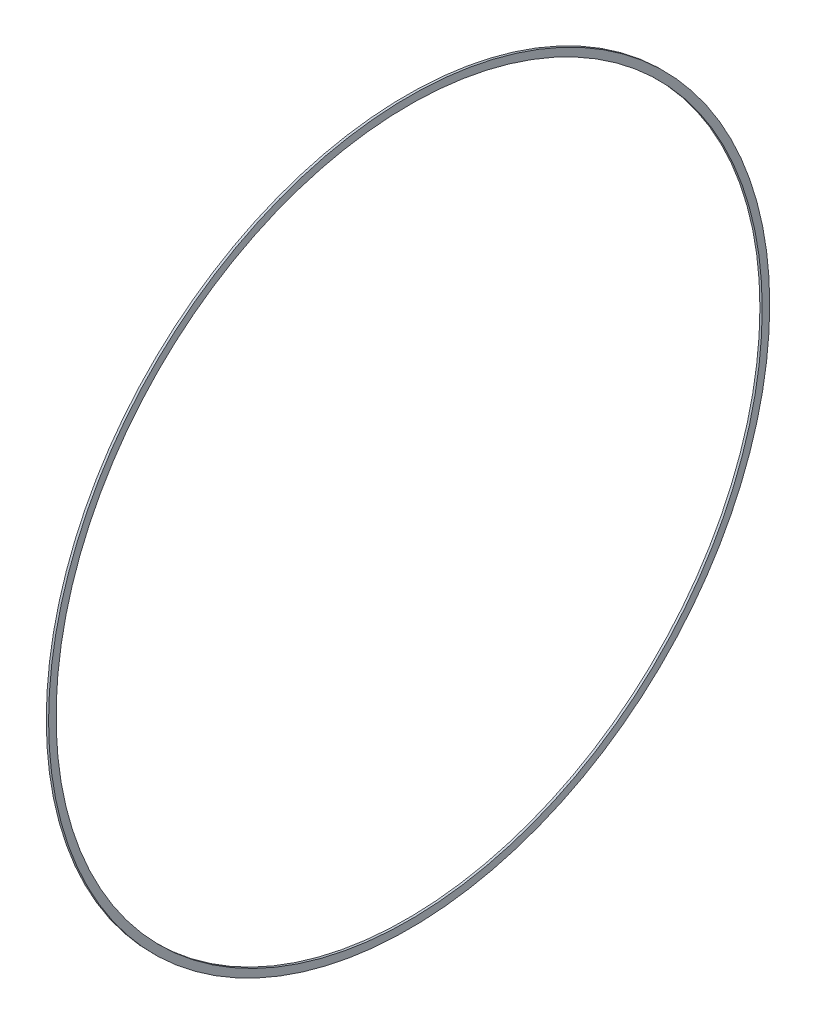
ISO-10303-21;
HEADER;
FILE_DESCRIPTION(('STEP AP214'),'2;1');
FILE_NAME('part.step','',(''),(''),'','','');
FILE_SCHEMA(('AUTOMOTIVE_DESIGN { 1 0 10303 214 1 1 1 1 }'));
ENDSEC;
DATA;
#1=APPLICATION_CONTEXT('core data for automotive mechanical design processes');
#2=APPLICATION_PROTOCOL_DEFINITION('international standard','automotive_design',2000,#1);
#3=PRODUCT_CONTEXT('',#1,'mechanical');
#4=PRODUCT('Part','Part','',(#3));
#5=PRODUCT_RELATED_PRODUCT_CATEGORY('part','',(#4));
#6=PRODUCT_DEFINITION_FORMATION('','',#4);
#7=PRODUCT_DEFINITION_CONTEXT('part definition',#1,'design');
#8=PRODUCT_DEFINITION('design','',#6,#7);
#9=PRODUCT_DEFINITION_SHAPE('','',#8);
#10=(LENGTH_UNIT() NAMED_UNIT(*) SI_UNIT(.MILLI.,.METRE.));
#11=(NAMED_UNIT(*) PLANE_ANGLE_UNIT() SI_UNIT($,.RADIAN.));
#12=(NAMED_UNIT(*) SI_UNIT($,.STERADIAN.) SOLID_ANGLE_UNIT());
#13=UNCERTAINTY_MEASURE_WITH_UNIT(LENGTH_MEASURE(1.E-05),#10,'distance_accuracy_value','');
#14=(GEOMETRIC_REPRESENTATION_CONTEXT(3) GLOBAL_UNCERTAINTY_ASSIGNED_CONTEXT((#13)) GLOBAL_UNIT_ASSIGNED_CONTEXT((#10,
#11,#12)) REPRESENTATION_CONTEXT('',''));
#15=CARTESIAN_POINT('',(0.,0.,0.));
#16=DIRECTION('',(0.,0.,1.));
#17=DIRECTION('',(1.,0.,0.));
#18=AXIS2_PLACEMENT_3D('',#15,#16,#17);
#19=CARTESIAN_POINT('',(214.63,0.,-17.78));
#20=DIRECTION('',(1.,0.,0.));
#21=DIRECTION('',(0.,0.,-1.));
#22=AXIS2_PLACEMENT_3D('',#19,#20,#21);
#23=CYLINDRICAL_SURFACE('',#22,60.8816362248);
#24=CARTESIAN_POINT('',(214.63,0.,-17.78));
#25=DIRECTION('',(1.,0.,0.));
#26=DIRECTION('',(0.,0.,-1.));
#27=AXIS2_PLACEMENT_3D('',#24,#25,#26);
#28=CIRCLE('',#27,60.8816362248);
#29=CARTESIAN_POINT('',(214.63,0.,-78.6616362248));
#30=VERTEX_POINT('',#29);
#31=EDGE_CURVE('E28',#30,#30,#28,.F.);
#32=ORIENTED_EDGE('',*,*,#31,.F.);
#33=EDGE_LOOP('',(#32));
#34=FACE_BOUND('',#33,.T.);
#35=CARTESIAN_POINT('',(215.0206849438,0.,-17.78));
#36=DIRECTION('',(1.,0.,0.));
#37=DIRECTION('',(0.,0.,-1.));
#38=AXIS2_PLACEMENT_3D('',#35,#36,#37);
#39=CIRCLE('',#38,60.8816362248);
#40=CARTESIAN_POINT('',(215.0206849438,0.,-78.6616362248));
#41=VERTEX_POINT('',#40);
#42=EDGE_CURVE('E19',#41,#41,#39,.T.);
#43=ORIENTED_EDGE('',*,*,#42,.F.);
#44=EDGE_LOOP('',(#43));
#45=FACE_BOUND('',#44,.T.);
#46=ADVANCED_FACE('F15',(#34,#45),#23,.T.);
#47=CARTESIAN_POINT('',(215.0206849438,-61.612215866,43.832215866));
#48=DIRECTION('',(1.,0.,0.));
#49=DIRECTION('',(0.,0.,-1.));
#50=AXIS2_PLACEMENT_3D('',#47,#48,#49);
#51=PLANE('',#50);
#52=CARTESIAN_POINT('',(215.0206849438,0.,-17.78));
#53=DIRECTION('',(1.,0.,0.));
#54=DIRECTION('',(0.,0.,-1.));
#55=AXIS2_PLACEMENT_3D('',#52,#53,#54);
#56=CIRCLE('',#55,59.6116362248);
#57=CARTESIAN_POINT('',(215.0206849438,0.,-77.3916362248));
#58=VERTEX_POINT('',#57);
#59=EDGE_CURVE('E23',#58,#58,#56,.T.);
#60=ORIENTED_EDGE('',*,*,#59,.F.);
#61=EDGE_LOOP('',(#60));
#62=FACE_BOUND('',#61,.T.);
#63=ORIENTED_EDGE('',*,*,#42,.T.);
#64=EDGE_LOOP('',(#63));
#65=FACE_BOUND('',#64,.T.);
#66=ADVANCED_FACE('F36',(#62,#65),#51,.T.);
#67=CARTESIAN_POINT('',(214.63,-61.612215866,-79.392215866));
#68=DIRECTION('',(-1.,0.,0.));
#69=DIRECTION('',(0.,0.,1.));
#70=AXIS2_PLACEMENT_3D('',#67,#68,#69);
#71=PLANE('',#70);
#72=CARTESIAN_POINT('',(214.63,0.,-17.78));
#73=DIRECTION('',(1.,0.,0.));
#74=DIRECTION('',(0.,0.,-1.));
#75=AXIS2_PLACEMENT_3D('',#72,#73,#74);
#76=CIRCLE('',#75,59.6116362248);
#77=CARTESIAN_POINT('',(214.63,0.,-77.3916362248));
#78=VERTEX_POINT('',#77);
#79=EDGE_CURVE('E10',#78,#78,#76,.F.);
#80=ORIENTED_EDGE('',*,*,#79,.F.);
#81=EDGE_LOOP('',(#80));
#82=FACE_BOUND('',#81,.T.);
#83=ORIENTED_EDGE('',*,*,#31,.T.);
#84=EDGE_LOOP('',(#83));
#85=FACE_BOUND('',#84,.T.);
#86=ADVANCED_FACE('F17',(#82,#85),#71,.T.);
#87=CARTESIAN_POINT('',(214.63,0.,-17.78));
#88=DIRECTION('',(1.,0.,0.));
#89=DIRECTION('',(0.,0.,-1.));
#90=AXIS2_PLACEMENT_3D('',#87,#88,#89);
#91=CYLINDRICAL_SURFACE('',#90,59.6116362248);
#92=ORIENTED_EDGE('',*,*,#79,.T.);
#93=EDGE_LOOP('',(#92));
#94=FACE_BOUND('',#93,.T.);
#95=ORIENTED_EDGE('',*,*,#59,.T.);
#96=EDGE_LOOP('',(#95));
#97=FACE_BOUND('',#96,.T.);
#98=ADVANCED_FACE('F47',(#94,#97),#91,.F.);
#99=CLOSED_SHELL('',(#46,#66,#86,#98));
#100=MANIFOLD_SOLID_BREP('B1',#99);
#101=ADVANCED_BREP_SHAPE_REPRESENTATION('',(#18,#100),#14);
#102=SHAPE_DEFINITION_REPRESENTATION(#9,#101);
ENDSEC;
END-ISO-10303-21;
